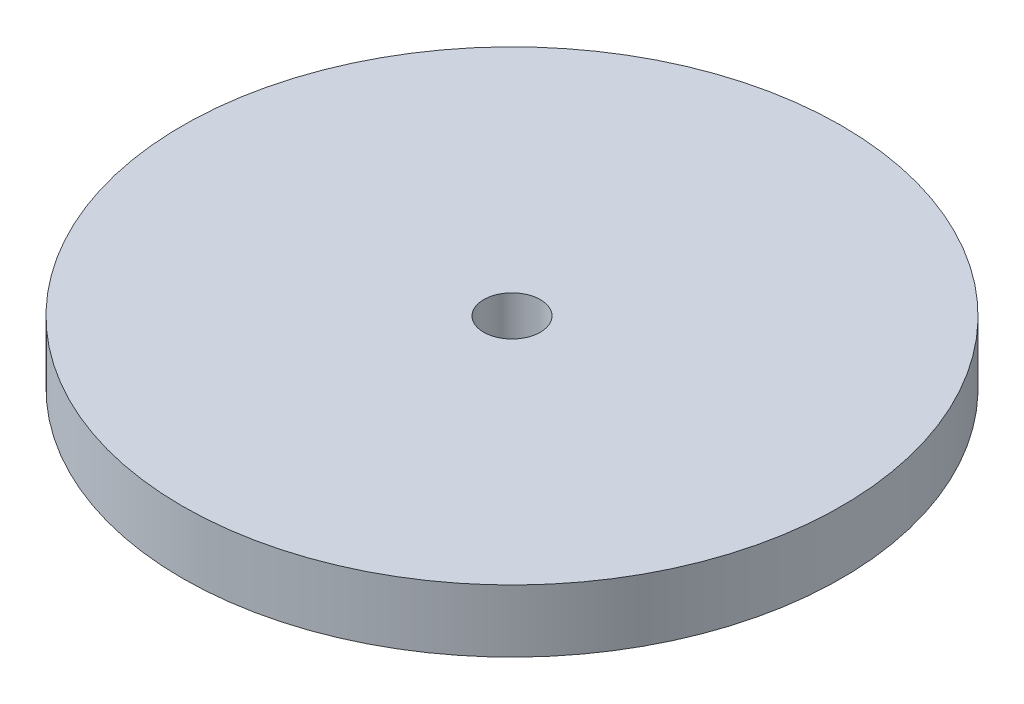
ISO-10303-21;
HEADER;
FILE_DESCRIPTION(('STEP AP214'),'2;1');
FILE_NAME('part.step','',(''),(''),'','','');
FILE_SCHEMA(('AUTOMOTIVE_DESIGN { 1 0 10303 214 1 1 1 1 }'));
ENDSEC;
DATA;
#1=APPLICATION_CONTEXT('core data for automotive mechanical design processes');
#2=APPLICATION_PROTOCOL_DEFINITION('international standard','automotive_design',2000,#1);
#3=PRODUCT_CONTEXT('',#1,'mechanical');
#4=PRODUCT('Part','Part','',(#3));
#5=PRODUCT_RELATED_PRODUCT_CATEGORY('part','',(#4));
#6=PRODUCT_DEFINITION_FORMATION('','',#4);
#7=PRODUCT_DEFINITION_CONTEXT('part definition',#1,'design');
#8=PRODUCT_DEFINITION('design','',#6,#7);
#9=PRODUCT_DEFINITION_SHAPE('','',#8);
#10=(LENGTH_UNIT() NAMED_UNIT(*) SI_UNIT(.MILLI.,.METRE.));
#11=(NAMED_UNIT(*) PLANE_ANGLE_UNIT() SI_UNIT($,.RADIAN.));
#12=(NAMED_UNIT(*) SI_UNIT($,.STERADIAN.) SOLID_ANGLE_UNIT());
#13=UNCERTAINTY_MEASURE_WITH_UNIT(LENGTH_MEASURE(1.E-05),#10,'distance_accuracy_value','');
#14=(GEOMETRIC_REPRESENTATION_CONTEXT(3) GLOBAL_UNCERTAINTY_ASSIGNED_CONTEXT((#13)) GLOBAL_UNIT_ASSIGNED_CONTEXT((#10,
#11,#12)) REPRESENTATION_CONTEXT('',''));
#15=CARTESIAN_POINT('',(0.,0.,0.));
#16=DIRECTION('',(0.,0.,1.));
#17=DIRECTION('',(1.,0.,0.));
#18=AXIS2_PLACEMENT_3D('',#15,#16,#17);
#19=CARTESIAN_POINT('',(0.,32.,0.));
#20=DIRECTION('',(0.,1.,0.));
#21=DIRECTION('',(0.,0.,1.));
#22=AXIS2_PLACEMENT_3D('',#19,#20,#21);
#23=PLANE('',#22);
#24=CARTESIAN_POINT('',(0.,32.,0.));
#25=DIRECTION('',(0.,1.,0.));
#26=DIRECTION('',(0.,0.,1.));
#27=AXIS2_PLACEMENT_3D('',#24,#25,#26);
#28=CIRCLE('',#27,337.5);
#29=CARTESIAN_POINT('',(0.,32.,337.5));
#30=VERTEX_POINT('',#29);
#31=EDGE_CURVE('E10',#30,#30,#28,.T.);
#32=ORIENTED_EDGE('',*,*,#31,.T.);
#33=EDGE_LOOP('',(#32));
#34=FACE_BOUND('',#33,.T.);
#35=CARTESIAN_POINT('',(0.,32.,0.));
#36=DIRECTION('',(0.,1.,0.));
#37=DIRECTION('',(0.,0.,1.));
#38=AXIS2_PLACEMENT_3D('',#35,#36,#37);
#39=CIRCLE('',#38,29.);
#40=CARTESIAN_POINT('',(0.,32.,29.));
#41=VERTEX_POINT('',#40);
#42=EDGE_CURVE('E42',#41,#41,#39,.T.);
#43=ORIENTED_EDGE('',*,*,#42,.F.);
#44=EDGE_LOOP('',(#43));
#45=FACE_BOUND('',#44,.T.);
#46=ADVANCED_FACE('F31',(#34,#45),#23,.T.);
#47=CARTESIAN_POINT('',(0.,-32.,0.));
#48=DIRECTION('',(0.,1.,0.));
#49=DIRECTION('',(0.,0.,1.));
#50=AXIS2_PLACEMENT_3D('',#47,#48,#49);
#51=PLANE('',#50);
#52=CARTESIAN_POINT('',(0.,-32.,0.));
#53=DIRECTION('',(0.,1.,0.));
#54=DIRECTION('',(0.,0.,1.));
#55=AXIS2_PLACEMENT_3D('',#52,#53,#54);
#56=CIRCLE('',#55,337.5);
#57=CARTESIAN_POINT('',(0.,-32.,337.5));
#58=VERTEX_POINT('',#57);
#59=EDGE_CURVE('E35',#58,#58,#56,.T.);
#60=ORIENTED_EDGE('',*,*,#59,.F.);
#61=EDGE_LOOP('',(#60));
#62=FACE_BOUND('',#61,.T.);
#63=CARTESIAN_POINT('',(0.,-32.,0.));
#64=DIRECTION('',(0.,1.,0.));
#65=DIRECTION('',(0.,0.,1.));
#66=AXIS2_PLACEMENT_3D('',#63,#64,#65);
#67=CIRCLE('',#66,29.);
#68=CARTESIAN_POINT('',(0.,-32.,29.));
#69=VERTEX_POINT('',#68);
#70=EDGE_CURVE('E44',#69,#69,#67,.T.);
#71=ORIENTED_EDGE('',*,*,#70,.T.);
#72=EDGE_LOOP('',(#71));
#73=FACE_BOUND('',#72,.T.);
#74=ADVANCED_FACE('F54',(#62,#73),#51,.F.);
#75=CARTESIAN_POINT('',(0.,32.,0.));
#76=DIRECTION('',(0.,-1.,0.));
#77=DIRECTION('',(0.,0.,-1.));
#78=AXIS2_PLACEMENT_3D('',#75,#76,#77);
#79=CYLINDRICAL_SURFACE('',#78,337.5);
#80=ORIENTED_EDGE('',*,*,#31,.F.);
#81=EDGE_LOOP('',(#80));
#82=FACE_BOUND('',#81,.T.);
#83=ORIENTED_EDGE('',*,*,#59,.T.);
#84=EDGE_LOOP('',(#83));
#85=FACE_BOUND('',#84,.T.);
#86=ADVANCED_FACE('F33',(#82,#85),#79,.T.);
#87=CARTESIAN_POINT('',(0.,32.,0.));
#88=DIRECTION('',(0.,-1.,0.));
#89=DIRECTION('',(0.,0.,-1.));
#90=AXIS2_PLACEMENT_3D('',#87,#88,#89);
#91=CYLINDRICAL_SURFACE('',#90,29.);
#92=ORIENTED_EDGE('',*,*,#42,.T.);
#93=EDGE_LOOP('',(#92));
#94=FACE_BOUND('',#93,.T.);
#95=ORIENTED_EDGE('',*,*,#70,.F.);
#96=EDGE_LOOP('',(#95));
#97=FACE_BOUND('',#96,.T.);
#98=ADVANCED_FACE('F50',(#94,#97),#91,.F.);
#99=CLOSED_SHELL('',(#46,#74,#86,#98));
#100=MANIFOLD_SOLID_BREP('B2',#99);
#101=ADVANCED_BREP_SHAPE_REPRESENTATION('',(#18,#100),#14);
#102=SHAPE_DEFINITION_REPRESENTATION(#9,#101);
ENDSEC;
END-ISO-10303-21;
